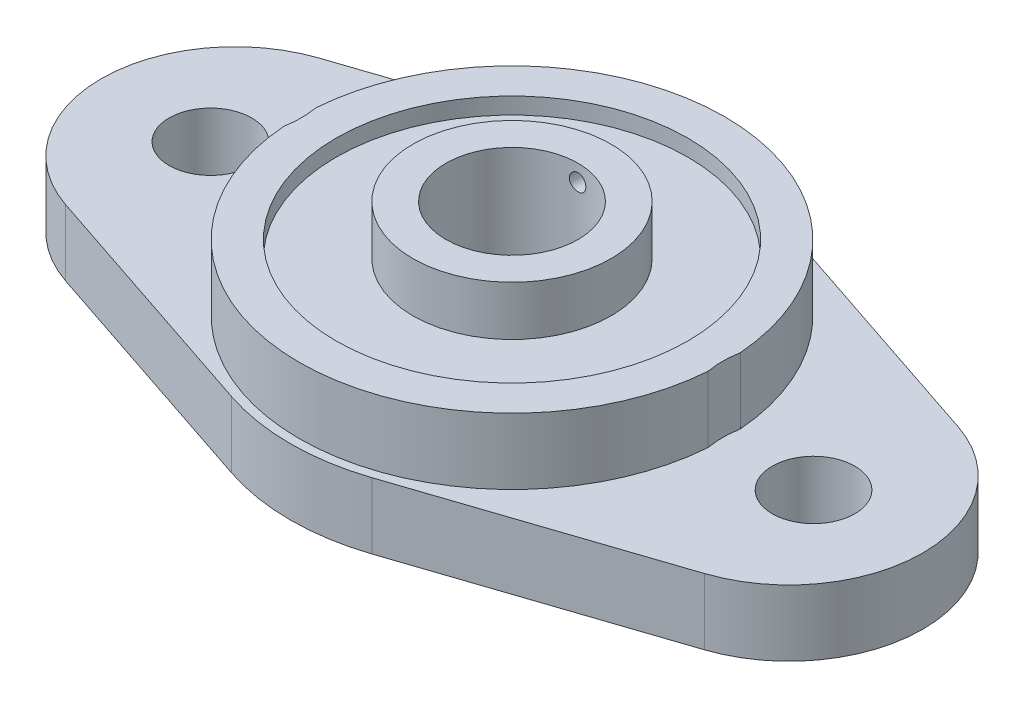
ISO-10303-21;
HEADER;
FILE_DESCRIPTION(('STEP AP214'),'2;1');
FILE_NAME('part.step','',(''),(''),'','','');
FILE_SCHEMA(('AUTOMOTIVE_DESIGN { 1 0 10303 214 1 1 1 1 }'));
ENDSEC;
DATA;
#1=APPLICATION_CONTEXT('core data for automotive mechanical design processes');
#2=APPLICATION_PROTOCOL_DEFINITION('international standard','automotive_design',2000,#1);
#3=PRODUCT_CONTEXT('',#1,'mechanical');
#4=PRODUCT('Part','Part','',(#3));
#5=PRODUCT_RELATED_PRODUCT_CATEGORY('part','',(#4));
#6=PRODUCT_DEFINITION_FORMATION('','',#4);
#7=PRODUCT_DEFINITION_CONTEXT('part definition',#1,'design');
#8=PRODUCT_DEFINITION('design','',#6,#7);
#9=PRODUCT_DEFINITION_SHAPE('','',#8);
#10=(LENGTH_UNIT() NAMED_UNIT(*) SI_UNIT(.MILLI.,.METRE.));
#11=(NAMED_UNIT(*) PLANE_ANGLE_UNIT() SI_UNIT($,.RADIAN.));
#12=(NAMED_UNIT(*) SI_UNIT($,.STERADIAN.) SOLID_ANGLE_UNIT());
#13=UNCERTAINTY_MEASURE_WITH_UNIT(LENGTH_MEASURE(1.E-05),#10,'distance_accuracy_value','');
#14=(GEOMETRIC_REPRESENTATION_CONTEXT(3) GLOBAL_UNCERTAINTY_ASSIGNED_CONTEXT((#13)) GLOBAL_UNIT_ASSIGNED_CONTEXT((#10,
#11,#12)) REPRESENTATION_CONTEXT('',''));
#15=CARTESIAN_POINT('',(0.,0.,0.));
#16=DIRECTION('',(0.,0.,1.));
#17=DIRECTION('',(1.,0.,0.));
#18=AXIS2_PLACEMENT_3D('',#15,#16,#17);
#19=CARTESIAN_POINT('',(0.,8.,0.));
#20=DIRECTION('',(0.,-1.,0.));
#21=DIRECTION('',(0.,0.,-1.));
#22=AXIS2_PLACEMENT_3D('',#19,#20,#21);
#23=CYLINDRICAL_SURFACE('',#22,12.875);
#24=CARTESIAN_POINT('',(0.,4.,0.));
#25=DIRECTION('',(0.,1.,0.));
#26=DIRECTION('',(0.,0.,1.));
#27=AXIS2_PLACEMENT_3D('',#24,#25,#26);
#28=CIRCLE('',#27,12.875);
#29=CARTESIAN_POINT('',(12.8377568493151,4.,-0.978582688312038));
#30=VERTEX_POINT('',#29);
#31=CARTESIAN_POINT('',(-12.8377568493151,4.,-0.978582688312053));
#32=VERTEX_POINT('',#31);
#33=EDGE_CURVE('E155',#30,#32,#28,.T.);
#34=ORIENTED_EDGE('',*,*,#33,.T.);
#35=DIRECTION('',(0.,1.,0.));
#36=VECTOR('',#35,1.);
#37=CARTESIAN_POINT('',(-12.8377568493151,6.,-0.978582688312049));
#38=LINE('',#37,#36);
#39=CARTESIAN_POINT('',(-12.8377568493151,8.,-0.978582688312053));
#40=VERTEX_POINT('',#39);
#41=EDGE_CURVE('E11',#32,#40,#38,.T.);
#42=ORIENTED_EDGE('',*,*,#41,.T.);
#43=CARTESIAN_POINT('',(0.,8.,0.));
#44=DIRECTION('',(0.,1.,0.));
#45=DIRECTION('',(0.,0.,1.));
#46=AXIS2_PLACEMENT_3D('',#43,#44,#45);
#47=CIRCLE('',#46,12.875);
#48=CARTESIAN_POINT('',(12.8377568493151,8.,-0.978582688312038));
#49=VERTEX_POINT('',#48);
#50=EDGE_CURVE('E188',#49,#40,#47,.T.);
#51=ORIENTED_EDGE('',*,*,#50,.F.);
#52=DIRECTION('',(0.,1.,0.));
#53=VECTOR('',#52,1.);
#54=CARTESIAN_POINT('',(12.8377568493151,6.,-0.978582688312053));
#55=LINE('',#54,#53);
#56=EDGE_CURVE('E234',#49,#30,#55,.F.);
#57=ORIENTED_EDGE('',*,*,#56,.T.);
#58=EDGE_LOOP('',(#34,#42,#51,#57));
#59=FACE_BOUND('',#58,.T.);
#60=ADVANCED_FACE('F43',(#59),#23,.T.);
#61=CARTESIAN_POINT('',(0.,10.,0.));
#62=DIRECTION('',(0.,1.,0.));
#63=DIRECTION('',(0.,0.,1.));
#64=AXIS2_PLACEMENT_3D('',#61,#62,#63);
#65=PLANE('',#64);
#66=CARTESIAN_POINT('',(0.,10.,0.));
#67=DIRECTION('',(0.,1.,0.));
#68=DIRECTION('',(0.,0.,1.));
#69=AXIS2_PLACEMENT_3D('',#66,#67,#68);
#70=CIRCLE('',#69,6.);
#71=CARTESIAN_POINT('',(0.,10.,6.));
#72=VERTEX_POINT('',#71);
#73=EDGE_CURVE('E229',#72,#72,#70,.T.);
#74=ORIENTED_EDGE('',*,*,#73,.T.);
#75=EDGE_LOOP('',(#74));
#76=FACE_BOUND('',#75,.T.);
#77=CARTESIAN_POINT('',(0.,10.,0.));
#78=DIRECTION('',(0.,1.,0.));
#79=DIRECTION('',(0.,0.,1.));
#80=AXIS2_PLACEMENT_3D('',#77,#78,#79);
#81=CIRCLE('',#80,4.);
#82=CARTESIAN_POINT('',(0.,10.,4.));
#83=VERTEX_POINT('',#82);
#84=EDGE_CURVE('E226',#83,#83,#81,.T.);
#85=ORIENTED_EDGE('',*,*,#84,.F.);
#86=EDGE_LOOP('',(#85));
#87=FACE_BOUND('',#86,.T.);
#88=ADVANCED_FACE('F338',(#76,#87),#65,.T.);
#89=CARTESIAN_POINT('',(0.,0.,0.));
#90=DIRECTION('',(0.,1.,0.));
#91=DIRECTION('',(0.,0.,1.));
#92=AXIS2_PLACEMENT_3D('',#89,#90,#91);
#93=PLANE('',#92);
#94=CARTESIAN_POINT('',(0.,0.,0.));
#95=DIRECTION('',(0.,1.,0.));
#96=DIRECTION('',(0.,0.,1.));
#97=AXIS2_PLACEMENT_3D('',#94,#95,#96);
#98=CIRCLE('',#97,4.);
#99=CARTESIAN_POINT('',(0.,0.,4.));
#100=VERTEX_POINT('',#99);
#101=EDGE_CURVE('E225',#100,#100,#98,.T.);
#102=ORIENTED_EDGE('',*,*,#101,.T.);
#103=EDGE_LOOP('',(#102));
#104=FACE_BOUND('',#103,.T.);
#105=CARTESIAN_POINT('',(-18.25,0.,0.));
#106=DIRECTION('',(0.,1.,0.));
#107=DIRECTION('',(0.,0.,1.));
#108=AXIS2_PLACEMENT_3D('',#105,#106,#107);
#109=CIRCLE('',#108,2.5);
#110=CARTESIAN_POINT('',(-18.25,0.,2.5));
#111=VERTEX_POINT('',#110);
#112=EDGE_CURVE('E251',#111,#111,#109,.T.);
#113=ORIENTED_EDGE('',*,*,#112,.T.);
#114=EDGE_LOOP('',(#113));
#115=FACE_BOUND('',#114,.T.);
#116=CARTESIAN_POINT('',(18.25,0.,0.));
#117=DIRECTION('',(0.,1.,0.));
#118=DIRECTION('',(0.,0.,1.));
#119=AXIS2_PLACEMENT_3D('',#116,#117,#118);
#120=CIRCLE('',#119,2.5);
#121=CARTESIAN_POINT('',(18.25,0.,2.49999999999999));
#122=VERTEX_POINT('',#121);
#123=EDGE_CURVE('E254',#122,#122,#120,.T.);
#124=ORIENTED_EDGE('',*,*,#123,.T.);
#125=EDGE_LOOP('',(#124));
#126=FACE_BOUND('',#125,.T.);
#127=CARTESIAN_POINT('',(0.,0.,0.));
#128=DIRECTION('',(0.,1.,0.));
#129=DIRECTION('',(0.,0.,1.));
#130=AXIS2_PLACEMENT_3D('',#127,#128,#129);
#131=CIRCLE('',#130,13.41);
#132=CARTESIAN_POINT('',(4.24863365155131,0.,-12.7191671148274));
#133=VERTEX_POINT('',#132);
#134=CARTESIAN_POINT('',(-4.24863365155131,0.,-12.7191671148274));
#135=VERTEX_POINT('',#134);
#136=EDGE_CURVE('E184',#133,#135,#131,.T.);
#137=ORIENTED_EDGE('',*,*,#136,.F.);
#138=DIRECTION('',(-0.948483752037835,0.,-0.316825775656324));
#139=VECTOR('',#138,1.);
#140=CARTESIAN_POINT('',(19.3262887828162,0.,-7.68271839150646));
#141=LINE('',#140,#139);
#142=CARTESIAN_POINT('',(19.3262887828162,0.,-7.68271839150646));
#143=VERTEX_POINT('',#142);
#144=EDGE_CURVE('E169',#143,#133,#141,.T.);
#145=ORIENTED_EDGE('',*,*,#144,.F.);
#146=CARTESIAN_POINT('',(16.76,0.,0.));
#147=DIRECTION('',(0.,1.,0.));
#148=DIRECTION('',(0.,0.,1.));
#149=AXIS2_PLACEMENT_3D('',#146,#147,#148);
#150=CIRCLE('',#149,8.1);
#151=CARTESIAN_POINT('',(19.3262887828162,0.,7.68271839150646));
#152=VERTEX_POINT('',#151);
#153=EDGE_CURVE('E198',#152,#143,#150,.T.);
#154=ORIENTED_EDGE('',*,*,#153,.F.);
#155=DIRECTION('',(0.948483752037835,0.,-0.316825775656324));
#156=VECTOR('',#155,1.);
#157=CARTESIAN_POINT('',(4.24863365155131,0.,12.7191671148274));
#158=LINE('',#157,#156);
#159=CARTESIAN_POINT('',(4.24863365155131,0.,12.7191671148274));
#160=VERTEX_POINT('',#159);
#161=EDGE_CURVE('E196',#160,#152,#158,.T.);
#162=ORIENTED_EDGE('',*,*,#161,.F.);
#163=CARTESIAN_POINT('',(0.,0.,0.));
#164=DIRECTION('',(0.,1.,0.));
#165=DIRECTION('',(0.,0.,1.));
#166=AXIS2_PLACEMENT_3D('',#163,#164,#165);
#167=CIRCLE('',#166,13.41);
#168=CARTESIAN_POINT('',(-4.24863365155132,0.,12.7191671148274));
#169=VERTEX_POINT('',#168);
#170=EDGE_CURVE('E194',#169,#160,#167,.T.);
#171=ORIENTED_EDGE('',*,*,#170,.F.);
#172=DIRECTION('',(0.948483752037835,0.,0.316825775656325));
#173=VECTOR('',#172,1.);
#174=CARTESIAN_POINT('',(-19.3262887828162,0.,7.68271839150646));
#175=LINE('',#174,#173);
#176=CARTESIAN_POINT('',(-19.3262887828162,0.,7.68271839150646));
#177=VERTEX_POINT('',#176);
#178=EDGE_CURVE('E192',#177,#169,#175,.T.);
#179=ORIENTED_EDGE('',*,*,#178,.F.);
#180=CARTESIAN_POINT('',(-16.7599999999998,0.,0.));
#181=DIRECTION('',(0.,1.,0.));
#182=DIRECTION('',(0.,0.,1.));
#183=AXIS2_PLACEMENT_3D('',#180,#181,#182);
#184=CIRCLE('',#183,8.10000000000006);
#185=CARTESIAN_POINT('',(-19.3262887828162,0.,-7.68271839150646));
#186=VERTEX_POINT('',#185);
#187=EDGE_CURVE('E190',#186,#177,#184,.T.);
#188=ORIENTED_EDGE('',*,*,#187,.F.);
#189=DIRECTION('',(-0.948483752037835,0.,0.316825775656325));
#190=VECTOR('',#189,1.);
#191=CARTESIAN_POINT('',(-4.24863365155131,0.,-12.7191671148274));
#192=LINE('',#191,#190);
#193=EDGE_CURVE('E187',#135,#186,#192,.T.);
#194=ORIENTED_EDGE('',*,*,#193,.F.);
#195=EDGE_LOOP('',(#137,#145,#154,#162,#171,#179,#188,#194));
#196=FACE_BOUND('',#195,.T.);
#197=ADVANCED_FACE('F340',(#104,#115,#126,#196),#93,.F.);
#198=CARTESIAN_POINT('',(0.,10.,0.));
#199=DIRECTION('',(0.,-1.,0.));
#200=DIRECTION('',(0.,0.,-1.));
#201=AXIS2_PLACEMENT_3D('',#198,#199,#200);
#202=CYLINDRICAL_SURFACE('',#201,6.);
#203=CARTESIAN_POINT('',(0.,9.5,-6.));
#204=CARTESIAN_POINT('',(-0.0280330449606023,9.49999877558686,-5.99999972705758));
#205=CARTESIAN_POINT('',(-0.056085173590113,9.49763451509448,-5.99980144271698));
#206=CARTESIAN_POINT('',(-0.111413285350195,9.48823782407246,-5.99902951164125));
#207=CARTESIAN_POINT('',(-0.138688352612615,9.48120010484755,-5.99845543965847));
#208=CARTESIAN_POINT('',(-0.191653011257131,9.46266142309532,-5.99699680623052));
#209=CARTESIAN_POINT('',(-0.217343490212308,9.45116298594509,-5.99611242049243));
#210=CARTESIAN_POINT('',(-0.266423616708038,9.424033784064,-5.99413233872356));
#211=CARTESIAN_POINT('',(-0.289813754942695,9.40840390326125,-5.99303668790679));
#212=CARTESIAN_POINT('',(-0.333694999982796,9.373412466697,-5.99075389933356));
#213=CARTESIAN_POINT('',(-0.354179436208081,9.35404255803216,-5.98956656043288));
#214=CARTESIAN_POINT('',(-0.391610566768278,9.31213855207503,-5.98723590401584));
#215=CARTESIAN_POINT('',(-0.408557105685754,9.28960431584869,-5.9860925884352));
#216=CARTESIAN_POINT('',(-0.438453961195115,9.24197094145049,-5.98397726330621));
#217=CARTESIAN_POINT('',(-0.451398416475772,9.21686811229861,-5.98300550590046));
#218=CARTESIAN_POINT('',(-0.472886216886923,9.16483585222201,-5.98134562224137));
#219=CARTESIAN_POINT('',(-0.481429639756209,9.13790645357087,-5.98065749097816));
#220=CARTESIAN_POINT('',(-0.493853514909286,9.08305230405941,-5.97964446033161));
#221=CARTESIAN_POINT('',(-0.497744832694888,9.0551300300037,-5.9793187146811));
#222=CARTESIAN_POINT('',(-0.500787604007714,8.99902689802732,-5.97906466160738));
#223=CARTESIAN_POINT('',(-0.49993914648977,8.9708460449695,-5.9791363467253));
#224=CARTESIAN_POINT('',(-0.493535432107424,8.91510016724474,-5.97966828680819));
#225=CARTESIAN_POINT('',(-0.487991984019029,8.8875337754618,-5.98012756688926));
#226=CARTESIAN_POINT('',(-0.472373992691471,8.83372406630353,-5.98138141784683));
#227=CARTESIAN_POINT('',(-0.462299405198393,8.80748076185308,-5.982175991998));
#228=CARTESIAN_POINT('',(-0.437891894076017,8.75702454706095,-5.98401202353426));
#229=CARTESIAN_POINT('',(-0.423553672378598,8.73281421120625,-5.98505378775482));
#230=CARTESIAN_POINT('',(-0.391029721956675,8.6871393305901,-5.9872665343194));
#231=CARTESIAN_POINT('',(-0.372843915311271,8.66567484145139,-5.98843751928016));
#232=CARTESIAN_POINT('',(-0.333074791113182,8.62603229035922,-5.99078110205823));
#233=CARTESIAN_POINT('',(-0.311481264695288,8.60786446793538,-5.99195369387533));
#234=CARTESIAN_POINT('',(-0.265545278185876,8.57541013830572,-5.99416495934917));
#235=CARTESIAN_POINT('',(-0.241202816257669,8.56112363369322,-5.99520363291643));
#236=CARTESIAN_POINT('',(-0.190453296633925,8.53683811866565,-5.9970302290482));
#237=CARTESIAN_POINT('',(-0.164046020904537,8.52683956176092,-5.99781812508722));
#238=CARTESIAN_POINT('',(-0.109919534509791,8.51142093377434,-5.99905408705899));
#239=CARTESIAN_POINT('',(-0.0822003510844272,8.50600076767237,-5.99950216004443));
#240=CARTESIAN_POINT('',(-0.0263256500821249,8.49990561797921,-6.00000708471525));
#241=CARTESIAN_POINT('',(0.0018283145575986,8.49921649094655,-6.00006510246001));
#242=CARTESIAN_POINT('',(0.0578513762516522,8.50256593031366,-5.9997864938935));
#243=CARTESIAN_POINT('',(0.085720475960707,8.50660445261473,-5.99944987126337));
#244=CARTESIAN_POINT('',(0.14034237811235,8.51928282930505,-5.9984205892066));
#245=CARTESIAN_POINT('',(0.167096712569862,8.52791612801291,-5.9977284370871));
#246=CARTESIAN_POINT('',(0.218777082541245,8.54953229389102,-5.99606585056176));
#247=CARTESIAN_POINT('',(0.243703089141567,8.56251522982925,-5.99509541175621));
#248=CARTESIAN_POINT('',(0.291083609150954,8.59249767460818,-5.99298213196816));
#249=CARTESIAN_POINT('',(0.313532175260735,8.60950655319741,-5.99183889109368));
#250=CARTESIAN_POINT('',(0.355260547421811,8.64704452852524,-5.98950979319849));
#251=CARTESIAN_POINT('',(0.374540298407192,8.66757368642464,-5.98832393543763));
#252=CARTESIAN_POINT('',(0.409432272727551,8.71163084609917,-5.98603980607911));
#253=CARTESIAN_POINT('',(0.425035266616819,8.7351661705987,-5.98494175937111));
#254=CARTESIAN_POINT('',(0.452067531419759,8.78453113143171,-5.9829607587216));
#255=CARTESIAN_POINT('',(0.463496844004982,8.81036074485497,-5.98207780263258));
#256=CARTESIAN_POINT('',(0.481841588720282,8.86354839526962,-5.9806282142447));
#257=CARTESIAN_POINT('',(0.488762670724645,8.89090447235717,-5.98006118614317));
#258=CARTESIAN_POINT('',(0.497912884955077,8.94639534993721,-5.97930632845426));
#259=CARTESIAN_POINT('',(0.500142107284133,8.9745301354648,-5.97911849158484));
#260=CARTESIAN_POINT('',(0.499844281445465,9.03068806301045,-5.97914338975097));
#261=CARTESIAN_POINT('',(0.497331734888695,9.05871128361822,-5.97935490346535));
#262=CARTESIAN_POINT('',(0.487651931647515,9.11393626677543,-5.98015207541153));
#263=CARTESIAN_POINT('',(0.480484667863814,9.14113802807192,-5.98073773421398));
#264=CARTESIAN_POINT('',(0.461702555008531,9.19394888163331,-5.98221688565853));
#265=CARTESIAN_POINT('',(0.450087967003266,9.21955806728285,-5.98311036023095));
#266=CARTESIAN_POINT('',(0.422742529473625,9.26846542028684,-5.98510449937535));
#267=CARTESIAN_POINT('',(0.407011744557279,9.29176362390666,-5.98620516069524));
#268=CARTESIAN_POINT('',(0.371825971061224,9.33546186950651,-5.98849365849341));
#269=CARTESIAN_POINT('',(0.35236024687073,9.35585325432867,-5.98968174002872));
#270=CARTESIAN_POINT('',(0.310276612796233,9.39308759260166,-5.99200897504839));
#271=CARTESIAN_POINT('',(0.287657941320546,9.40992968624801,-5.99314811662412));
#272=CARTESIAN_POINT('',(0.239866886514707,9.43960993020878,-5.99525117421137));
#273=CARTESIAN_POINT('',(0.214689828135269,9.45244056932816,-5.99621476011552));
#274=CARTESIAN_POINT('',(0.162547875997866,9.47367590152564,-5.9978542625815));
#275=CARTESIAN_POINT('',(0.135585077706825,9.48208568214405,-5.99853050964128));
#276=CARTESIAN_POINT('',(0.0903860240483398,9.49209879125103,-5.99934553866926));
#277=CARTESIAN_POINT('',(0.0724404472192353,9.49505780625874,-5.99958984438477));
#278=CARTESIAN_POINT('',(0.0363325857505812,9.4990088048386,-5.99991716329316));
#279=CARTESIAN_POINT('',(0.0181703016865225,9.50000079363324,-6.00000017691429));
#280=CARTESIAN_POINT('',(0.,9.5,-6.));
#281=B_SPLINE_CURVE_WITH_KNOTS('',3,(#203,#204,#205,#206,#207,#208,#209,#210,#211,#212,#213,
#214,#215,#216,#217,#218,#219,#220,#221,#222,#223,#224,#225,#226,#227,#228,#229,#230,#231,#232,
#233,#234,#235,#236,#237,#238,#239,#240,#241,#242,#243,#244,#245,#246,#247,#248,#249,#250,#251,
#252,#253,#254,#255,#256,#257,#258,#259,#260,#261,#262,#263,#264,#265,#266,#267,#268,#269,#270,
#271,#272,#273,#274,#275,#276,#277,#278,#279,#280),.UNSPECIFIED.,.T.,.F.,(4,2,2,2,2,2,2,2,2,2,2,
2,2,2,2,2,2,2,2,2,2,2,2,2,2,2,2,2,2,2,2,2,2,2,2,2,2,2,4),(0.,0.08403279340007,0.168160844498918,
0.252241336944478,0.336303854792091,0.420556334392882,0.50481251436966,0.589191514755458,
0.673569024639505,0.757749074157934,0.841927543813095,0.925894915551446,1.00986310738499,
1.0939360787445,1.1780107529043,1.26234225467575,1.34667381279322,1.43101428795225,
1.51535301266268,1.59943949653584,1.68352519607111,1.76749124515393,1.85145862180686,
1.93562337487463,2.01978959035625,2.10416488245601,2.18853933209914,2.27280783620464,
2.35707472199379,2.44108431441264,2.5250940349617,2.60909882473762,2.69310229604928,
2.77735094332319,2.8616199761624,2.94604586531277,3.03037438295893,3.08484243178331,
3.13931033599373),.UNSPECIFIED.);
#282=CARTESIAN_POINT('',(0.,9.5,-6.));
#283=VERTEX_POINT('',#282);
#284=EDGE_CURVE('E262',#283,#283,#281,.T.);
#285=ORIENTED_EDGE('',*,*,#284,.T.);
#286=EDGE_LOOP('',(#285));
#287=FACE_BOUND('',#286,.T.);
#288=CARTESIAN_POINT('',(0.,7.,0.));
#289=DIRECTION('',(0.,1.,0.));
#290=DIRECTION('',(0.,0.,1.));
#291=AXIS2_PLACEMENT_3D('',#288,#289,#290);
#292=CIRCLE('',#291,6.);
#293=CARTESIAN_POINT('',(0.,7.,6.));
#294=VERTEX_POINT('',#293);
#295=EDGE_CURVE('E222',#294,#294,#292,.T.);
#296=ORIENTED_EDGE('',*,*,#295,.T.);
#297=EDGE_LOOP('',(#296));
#298=FACE_BOUND('',#297,.T.);
#299=ORIENTED_EDGE('',*,*,#73,.F.);
#300=EDGE_LOOP('',(#299));
#301=FACE_BOUND('',#300,.T.);
#302=ADVANCED_FACE('F45',(#287,#298,#301),#202,.T.);
#303=CARTESIAN_POINT('',(0.,10.,0.));
#304=DIRECTION('',(0.,-1.,0.));
#305=DIRECTION('',(0.,0.,-1.));
#306=AXIS2_PLACEMENT_3D('',#303,#304,#305);
#307=CYLINDRICAL_SURFACE('',#306,4.);
#308=CARTESIAN_POINT('',(0.,9.5,-4.));
#309=CARTESIAN_POINT('',(-0.0279682191111522,9.49999881181286,-3.99999960979286));
#310=CARTESIAN_POINT('',(-0.0559539148605493,9.49764542416614,-3.9997035691098));
#311=CARTESIAN_POINT('',(-0.111146560417951,9.48829444908584,-3.99855108022272));
#312=CARTESIAN_POINT('',(-0.138352666124749,9.48129201241532,-3.99769404688286));
#313=CARTESIAN_POINT('',(-0.191179114962611,9.46285247121718,-3.99551612208881));
#314=CARTESIAN_POINT('',(-0.216800512029228,9.45141835163803,-3.99419554291108));
#315=CARTESIAN_POINT('',(-0.265755894978607,9.42444654320604,-3.9912374017562));
#316=CARTESIAN_POINT('',(-0.289090272311274,9.40890955829386,-3.98959989416823));
#317=CARTESIAN_POINT('',(-0.332942563386264,9.37408161003208,-3.98618064261265));
#318=CARTESIAN_POINT('',(-0.353446072987425,9.35477257413075,-3.98439822938483));
#319=CARTESIAN_POINT('',(-0.390930558711499,9.31298743529267,-3.9808954520195));
#320=CARTESIAN_POINT('',(-0.407911355278451,9.29051117101735,-3.97917509104854));
#321=CARTESIAN_POINT('',(-0.437922032256788,9.24293600448687,-3.97598461123917));
#322=CARTESIAN_POINT('',(-0.450938419188215,9.21782852768641,-3.97451535435582));
#323=CARTESIAN_POINT('',(-0.472564615315023,9.16576258961053,-3.97200225691537));
#324=CARTESIAN_POINT('',(-0.481174591613043,9.1388041985706,-3.97095840022627));
#325=CARTESIAN_POINT('',(-0.493699796004953,9.08395116088265,-3.96942067920723));
#326=CARTESIAN_POINT('',(-0.49763934294634,9.05606214845916,-3.96892396687349));
#327=CARTESIAN_POINT('',(-0.500787109911446,9.00001474730564,-3.96852805628558));
#328=CARTESIAN_POINT('',(-0.499995520200484,8.97185636945374,-3.96862883400302));
#329=CARTESIAN_POINT('',(-0.493723447289581,8.91623903455024,-3.9694139107395));
#330=CARTESIAN_POINT('',(-0.488269752596939,8.88877700275995,-3.97009487592066));
#331=CARTESIAN_POINT('',(-0.47287007663641,8.8351609957562,-3.97195839951526));
#332=CARTESIAN_POINT('',(-0.46292400435038,8.80900704705719,-3.97314096809145));
#333=CARTESIAN_POINT('',(-0.438793111982329,8.75866640019566,-3.9758782317293));
#334=CARTESIAN_POINT('',(-0.424596650741527,8.7344853399502,-3.97743394642289));
#335=CARTESIAN_POINT('',(-0.392376293891383,8.68883866111735,-3.9807414228612));
#336=CARTESIAN_POINT('',(-0.374352223216155,8.66737316680526,-3.98249319357133));
#337=CARTESIAN_POINT('',(-0.334839822150756,8.62761145785545,-3.98601021978085));
#338=CARTESIAN_POINT('',(-0.313328401568002,8.60933818164681,-3.98777548477378));
#339=CARTESIAN_POINT('',(-0.267531433822785,8.57665822399389,-3.9911092651117));
#340=CARTESIAN_POINT('',(-0.243245880263651,8.5622515514656,-3.99267778000301));
#341=CARTESIAN_POINT('',(-0.192572334272697,8.53771373590722,-3.99544230443716));
#342=CARTESIAN_POINT('',(-0.166183639067544,8.52758402922376,-3.99663818880307));
#343=CARTESIAN_POINT('',(-0.112061588086211,8.51190590129535,-3.99852157156012));
#344=CARTESIAN_POINT('',(-0.0843282953261333,8.50635726557259,-3.99920909375174));
#345=CARTESIAN_POINT('',(-0.0285026327826991,8.50002851514789,-3.99999519282152));
#346=CARTESIAN_POINT('',(-0.000413898039721187,8.49921680152719,-4.00009767228527));
#347=CARTESIAN_POINT('',(0.0554992072994993,8.50230154681119,-3.99971267601086));
#348=CARTESIAN_POINT('',(0.0833235835129413,8.50619790545032,-3.99922521283642));
#349=CARTESIAN_POINT('',(0.137824901544304,8.51856194175488,-3.99771753751338));
#350=CARTESIAN_POINT('',(0.164505314084941,8.52701455268053,-3.99669908162774));
#351=CARTESIAN_POINT('',(0.216069930971682,8.54823549038258,-3.99424344620039));
#352=CARTESIAN_POINT('',(0.240954074293063,8.56100396369829,-3.99280625244125));
#353=CARTESIAN_POINT('',(0.288360904137486,8.59057062750149,-3.98966364582022));
#354=CARTESIAN_POINT('',(0.310870751988764,8.60738925796113,-3.98795688808502));
#355=CARTESIAN_POINT('',(0.352759397925264,8.64454989950684,-3.98447028465131));
#356=CARTESIAN_POINT('',(0.372138071667372,8.6648920504502,-3.9826904360538));
#357=CARTESIAN_POINT('',(0.407326391763603,8.70866148335143,-3.97924621092517));
#358=CARTESIAN_POINT('',(0.423115092113586,8.73210566926208,-3.97758254944265));
#359=CARTESIAN_POINT('',(0.450530577888701,8.78133164897094,-3.9745708220743));
#360=CARTESIAN_POINT('',(0.462157446745673,8.80711339589531,-3.97322274986205));
#361=CARTESIAN_POINT('',(0.480885315773308,8.86021506382952,-3.97099970078599));
#362=CARTESIAN_POINT('',(0.487998125491422,8.8875307660096,-3.97012349036958));
#363=CARTESIAN_POINT('',(0.497533998773569,8.94298049675613,-3.96893983181491));
#364=CARTESIAN_POINT('',(0.499957280507153,8.9711144871918,-3.96863235721755));
#365=CARTESIAN_POINT('',(0.500041307216967,9.02719378584094,-3.96862175396491));
#366=CARTESIAN_POINT('',(0.497734959539855,9.05513904966638,-3.96891444950391));
#367=CARTESIAN_POINT('',(0.488494880969866,9.11024142586902,-3.9700622290744));
#368=CARTESIAN_POINT('',(0.481561149581154,9.13739853816176,-3.97091731316616));
#369=CARTESIAN_POINT('',(0.463273414737932,9.19014939135328,-3.9730922315491));
#370=CARTESIAN_POINT('',(0.451920996194187,9.21574368900436,-3.97441189918557));
#371=CARTESIAN_POINT('',(0.425121380430062,9.26466933080966,-3.97736756648964));
#372=CARTESIAN_POINT('',(0.409674131901919,9.28800064660397,-3.97900357012082));
#373=CARTESIAN_POINT('',(0.375001266253168,9.3319062450681,-3.98242120950447));
#374=CARTESIAN_POINT('',(0.355751125154992,9.352461092191,-3.98420374416807));
#375=CARTESIAN_POINT('',(0.314070045393677,9.3900613650336,-3.9877056631858));
#376=CARTESIAN_POINT('',(0.291638357828314,9.40710596215486,-3.98942503255118));
#377=CARTESIAN_POINT('',(0.244133124170843,9.43725707142106,-3.99261411317349));
#378=CARTESIAN_POINT('',(0.219049855919234,9.45034836117985,-3.9940828501566));
#379=CARTESIAN_POINT('',(0.167036580460255,9.47211424858326,-3.99659529815345));
#380=CARTESIAN_POINT('',(0.140108616174047,9.48079364527069,-3.99763947073915));
#381=CARTESIAN_POINT('',(0.0942011543935844,9.49141186763426,-3.99893344065549));
#382=CARTESIAN_POINT('',(0.0755111327033838,9.49462778839641,-3.99933145179091));
#383=CARTESIAN_POINT('',(0.0378834126424868,9.49892224913865,-3.99986486265838));
#384=CARTESIAN_POINT('',(0.0189457160992054,9.50000080487986,-4.00000026432694));
#385=CARTESIAN_POINT('',(0.,9.5,-4.));
#386=B_SPLINE_CURVE_WITH_KNOTS('',3,(#308,#309,#310,#311,#312,#313,#314,#315,#316,#317,#318,
#319,#320,#321,#322,#323,#324,#325,#326,#327,#328,#329,#330,#331,#332,#333,#334,#335,#336,#337,
#338,#339,#340,#341,#342,#343,#344,#345,#346,#347,#348,#349,#350,#351,#352,#353,#354,#355,#356,
#357,#358,#359,#360,#361,#362,#363,#364,#365,#366,#367,#368,#369,#370,#371,#372,#373,#374,#375,
#376,#377,#378,#379,#380,#381,#382,#383,#384,#385),.UNSPECIFIED.,.T.,.F.,(4,2,2,2,2,2,2,2,2,2,2,
2,2,2,2,2,2,2,2,2,2,2,2,2,2,2,2,2,2,2,2,2,2,2,2,2,2,2,4),(0.,0.0838354545552494,
0.167758492188685,0.251625101636355,0.335477331182147,0.419741626403686,0.504010215600022,
0.588562500637739,0.673111578993614,0.757218450572639,0.841321939769328,0.924945392883386,
1.00857054033249,1.09242685257107,1.17628700102728,1.26072695627283,1.34516710622623,
1.42963559146321,1.51410012180756,1.59800055878384,1.68189920900386,1.76552210778679,
1.8491478461579,1.93320480585685,2.01726510275018,2.10180394301515,2.18634108844308,
2.27065614856185,2.35496728602125,2.43869380240443,2.5224203277591,2.60611684941298,
2.68981441982453,2.77407047538366,2.85834639694003,2.94294280607371,3.02744699736807,
3.08423768637526,3.14102795660088),.UNSPECIFIED.);
#387=CARTESIAN_POINT('',(0.,9.5,-4.));
#388=VERTEX_POINT('',#387);
#389=EDGE_CURVE('E48',#388,#388,#386,.T.);
#390=ORIENTED_EDGE('',*,*,#389,.F.);
#391=EDGE_LOOP('',(#390));
#392=FACE_BOUND('',#391,.T.);
#393=ORIENTED_EDGE('',*,*,#84,.T.);
#394=EDGE_LOOP('',(#393));
#395=FACE_BOUND('',#394,.T.);
#396=ORIENTED_EDGE('',*,*,#101,.F.);
#397=EDGE_LOOP('',(#396));
#398=FACE_BOUND('',#397,.T.);
#399=ADVANCED_FACE('F332',(#392,#395,#398),#307,.F.);
#400=CARTESIAN_POINT('',(0.,7.,0.));
#401=DIRECTION('',(0.,1.,0.));
#402=DIRECTION('',(0.,0.,1.));
#403=AXIS2_PLACEMENT_3D('',#400,#401,#402);
#404=PLANE('',#403);
#405=CARTESIAN_POINT('',(0.,7.,0.));
#406=DIRECTION('',(0.,1.,0.));
#407=DIRECTION('',(0.,0.,1.));
#408=AXIS2_PLACEMENT_3D('',#405,#406,#407);
#409=CIRCLE('',#408,10.64);
#410=CARTESIAN_POINT('',(0.,7.,10.64));
#411=VERTEX_POINT('',#410);
#412=EDGE_CURVE('E158',#411,#411,#409,.F.);
#413=ORIENTED_EDGE('',*,*,#412,.F.);
#414=EDGE_LOOP('',(#413));
#415=FACE_BOUND('',#414,.T.);
#416=ORIENTED_EDGE('',*,*,#295,.F.);
#417=EDGE_LOOP('',(#416));
#418=FACE_BOUND('',#417,.T.);
#419=ADVANCED_FACE('F300',(#415,#418),#404,.T.);
#420=CARTESIAN_POINT('',(0.,4.,0.));
#421=DIRECTION('',(0.,1.,0.));
#422=DIRECTION('',(0.,0.,1.));
#423=AXIS2_PLACEMENT_3D('',#420,#421,#422);
#424=PLANE('',#423);
#425=CARTESIAN_POINT('',(-12.8377568493151,4.,0.978582688312053));
#426=VERTEX_POINT('',#425);
#427=CARTESIAN_POINT('',(12.8377568493151,4.,0.978582688312029));
#428=VERTEX_POINT('',#427);
#429=EDGE_CURVE('E148',#426,#428,#28,.T.);
#430=ORIENTED_EDGE('',*,*,#429,.F.);
#431=CARTESIAN_POINT('',(-18.25,4.,0.));
#432=DIRECTION('',(0.,1.,0.));
#433=DIRECTION('',(0.,0.,1.));
#434=AXIS2_PLACEMENT_3D('',#431,#432,#433);
#435=CIRCLE('',#434,5.5);
#436=EDGE_CURVE('E65',#32,#426,#435,.F.);
#437=ORIENTED_EDGE('',*,*,#436,.F.);
#438=ORIENTED_EDGE('',*,*,#33,.F.);
#439=CARTESIAN_POINT('',(18.25,4.,0.));
#440=DIRECTION('',(0.,1.,0.));
#441=DIRECTION('',(0.,0.,1.));
#442=AXIS2_PLACEMENT_3D('',#439,#440,#441);
#443=CIRCLE('',#442,5.5);
#444=EDGE_CURVE('E70',#428,#30,#443,.F.);
#445=ORIENTED_EDGE('',*,*,#444,.F.);
#446=EDGE_LOOP('',(#430,#437,#438,#445));
#447=FACE_BOUND('',#446,.T.);
#448=CARTESIAN_POINT('',(0.,4.,0.));
#449=DIRECTION('',(0.,1.,0.));
#450=DIRECTION('',(0.,0.,1.));
#451=AXIS2_PLACEMENT_3D('',#448,#449,#450);
#452=CIRCLE('',#451,13.41);
#453=CARTESIAN_POINT('',(4.24863365155131,4.,-12.7191671148274));
#454=VERTEX_POINT('',#453);
#455=CARTESIAN_POINT('',(-4.24863365155131,4.,-12.7191671148274));
#456=VERTEX_POINT('',#455);
#457=EDGE_CURVE('E165',#454,#456,#452,.T.);
#458=ORIENTED_EDGE('',*,*,#457,.T.);
#459=DIRECTION('',(-0.948483752037835,0.,0.316825775656325));
#460=VECTOR('',#459,1.);
#461=CARTESIAN_POINT('',(-4.24863365155131,4.,-12.7191671148274));
#462=LINE('',#461,#460);
#463=CARTESIAN_POINT('',(-19.3262887828162,4.,-7.68271839150646));
#464=VERTEX_POINT('',#463);
#465=EDGE_CURVE('E168',#456,#464,#462,.T.);
#466=ORIENTED_EDGE('',*,*,#465,.T.);
#467=CARTESIAN_POINT('',(-16.7599999999998,4.,0.));
#468=DIRECTION('',(0.,1.,0.));
#469=DIRECTION('',(0.,0.,1.));
#470=AXIS2_PLACEMENT_3D('',#467,#468,#469);
#471=CIRCLE('',#470,8.10000000000006);
#472=CARTESIAN_POINT('',(-19.3262887828162,4.,7.68271839150646));
#473=VERTEX_POINT('',#472);
#474=EDGE_CURVE('E171',#464,#473,#471,.T.);
#475=ORIENTED_EDGE('',*,*,#474,.T.);
#476=DIRECTION('',(0.948483752037835,0.,0.316825775656325));
#477=VECTOR('',#476,1.);
#478=CARTESIAN_POINT('',(-19.3262887828162,4.,7.68271839150646));
#479=LINE('',#478,#477);
#480=CARTESIAN_POINT('',(-4.24863365155132,4.,12.7191671148274));
#481=VERTEX_POINT('',#480);
#482=EDGE_CURVE('E173',#473,#481,#479,.T.);
#483=ORIENTED_EDGE('',*,*,#482,.T.);
#484=CARTESIAN_POINT('',(0.,4.,0.));
#485=DIRECTION('',(0.,1.,0.));
#486=DIRECTION('',(0.,0.,1.));
#487=AXIS2_PLACEMENT_3D('',#484,#485,#486);
#488=CIRCLE('',#487,13.41);
#489=CARTESIAN_POINT('',(4.24863365155131,4.,12.7191671148274));
#490=VERTEX_POINT('',#489);
#491=EDGE_CURVE('E175',#481,#490,#488,.T.);
#492=ORIENTED_EDGE('',*,*,#491,.T.);
#493=DIRECTION('',(0.948483752037835,0.,-0.316825775656324));
#494=VECTOR('',#493,1.);
#495=CARTESIAN_POINT('',(4.24863365155131,4.,12.7191671148274));
#496=LINE('',#495,#494);
#497=CARTESIAN_POINT('',(19.3262887828162,4.,7.68271839150646));
#498=VERTEX_POINT('',#497);
#499=EDGE_CURVE('E177',#490,#498,#496,.T.);
#500=ORIENTED_EDGE('',*,*,#499,.T.);
#501=CARTESIAN_POINT('',(16.76,4.,0.));
#502=DIRECTION('',(0.,1.,0.));
#503=DIRECTION('',(0.,0.,1.));
#504=AXIS2_PLACEMENT_3D('',#501,#502,#503);
#505=CIRCLE('',#504,8.1);
#506=CARTESIAN_POINT('',(19.3262887828162,4.,-7.68271839150646));
#507=VERTEX_POINT('',#506);
#508=EDGE_CURVE('E179',#498,#507,#505,.T.);
#509=ORIENTED_EDGE('',*,*,#508,.T.);
#510=DIRECTION('',(-0.948483752037835,0.,-0.316825775656324));
#511=VECTOR('',#510,1.);
#512=CARTESIAN_POINT('',(19.3262887828162,4.,-7.68271839150646));
#513=LINE('',#512,#511);
#514=EDGE_CURVE('E181',#507,#454,#513,.T.);
#515=ORIENTED_EDGE('',*,*,#514,.T.);
#516=EDGE_LOOP('',(#458,#466,#475,#483,#492,#500,#509,#515));
#517=FACE_BOUND('',#516,.T.);
#518=CARTESIAN_POINT('',(18.25,4.,0.));
#519=DIRECTION('',(0.,1.,0.));
#520=DIRECTION('',(0.,0.,1.));
#521=AXIS2_PLACEMENT_3D('',#518,#519,#520);
#522=CIRCLE('',#521,2.5);
#523=CARTESIAN_POINT('',(18.25,4.,2.49999999999999));
#524=VERTEX_POINT('',#523);
#525=EDGE_CURVE('E140',#524,#524,#522,.T.);
#526=ORIENTED_EDGE('',*,*,#525,.F.);
#527=EDGE_LOOP('',(#526));
#528=FACE_BOUND('',#527,.T.);
#529=CARTESIAN_POINT('',(-18.25,4.,0.));
#530=DIRECTION('',(0.,1.,0.));
#531=DIRECTION('',(0.,0.,1.));
#532=AXIS2_PLACEMENT_3D('',#529,#530,#531);
#533=CIRCLE('',#532,2.5);
#534=CARTESIAN_POINT('',(-18.25,4.,2.5));
#535=VERTEX_POINT('',#534);
#536=EDGE_CURVE('E247',#535,#535,#533,.T.);
#537=ORIENTED_EDGE('',*,*,#536,.F.);
#538=EDGE_LOOP('',(#537));
#539=FACE_BOUND('',#538,.T.);
#540=ADVANCED_FACE('F153',(#447,#517,#528,#539),#424,.T.);
#541=CARTESIAN_POINT('',(0.,4.,0.));
#542=DIRECTION('',(0.,-1.,0.));
#543=DIRECTION('',(0.,0.,-1.));
#544=AXIS2_PLACEMENT_3D('',#541,#542,#543);
#545=CYLINDRICAL_SURFACE('',#544,13.41);
#546=ORIENTED_EDGE('',*,*,#136,.T.);
#547=DIRECTION('',(0.,-1.,0.));
#548=VECTOR('',#547,1.);
#549=CARTESIAN_POINT('',(-4.24863365155131,4.,-12.7191671148274));
#550=LINE('',#549,#548);
#551=EDGE_CURVE('E156',#456,#135,#550,.T.);
#552=ORIENTED_EDGE('',*,*,#551,.F.);
#553=ORIENTED_EDGE('',*,*,#457,.F.);
#554=DIRECTION('',(0.,-1.,0.));
#555=VECTOR('',#554,1.);
#556=CARTESIAN_POINT('',(4.24863365155131,4.,-12.7191671148274));
#557=LINE('',#556,#555);
#558=EDGE_CURVE('E183',#454,#133,#557,.T.);
#559=ORIENTED_EDGE('',*,*,#558,.T.);
#560=EDGE_LOOP('',(#546,#552,#553,#559));
#561=FACE_BOUND('',#560,.T.);
#562=ADVANCED_FACE('F299',(#561),#545,.T.);
#563=CARTESIAN_POINT('',(-4.24863365155131,4.,-12.7191671148274));
#564=DIRECTION('',(0.316825775656325,0.,0.948483752037835));
#565=DIRECTION('',(0.948483752037835,0.,-0.316825775656325));
#566=AXIS2_PLACEMENT_3D('',#563,#564,#565);
#567=PLANE('',#566);
#568=ORIENTED_EDGE('',*,*,#193,.T.);
#569=DIRECTION('',(0.,-1.,0.));
#570=VECTOR('',#569,1.);
#571=CARTESIAN_POINT('',(-19.3262887828162,4.,-7.68271839150646));
#572=LINE('',#571,#570);
#573=EDGE_CURVE('E160',#464,#186,#572,.T.);
#574=ORIENTED_EDGE('',*,*,#573,.F.);
#575=ORIENTED_EDGE('',*,*,#465,.F.);
#576=ORIENTED_EDGE('',*,*,#551,.T.);
#577=EDGE_LOOP('',(#568,#574,#575,#576));
#578=FACE_BOUND('',#577,.T.);
#579=ADVANCED_FACE('F323',(#578),#567,.F.);
#580=CARTESIAN_POINT('',(-16.7599999999998,4.,0.));
#581=DIRECTION('',(0.,-1.,0.));
#582=DIRECTION('',(0.,0.,-1.));
#583=AXIS2_PLACEMENT_3D('',#580,#581,#582);
#584=CYLINDRICAL_SURFACE('',#583,8.10000000000006);
#585=ORIENTED_EDGE('',*,*,#187,.T.);
#586=DIRECTION('',(0.,-1.,0.));
#587=VECTOR('',#586,1.);
#588=CARTESIAN_POINT('',(-19.3262887828162,4.,7.68271839150646));
#589=LINE('',#588,#587);
#590=EDGE_CURVE('E215',#473,#177,#589,.T.);
#591=ORIENTED_EDGE('',*,*,#590,.F.);
#592=ORIENTED_EDGE('',*,*,#474,.F.);
#593=ORIENTED_EDGE('',*,*,#573,.T.);
#594=EDGE_LOOP('',(#585,#591,#592,#593));
#595=FACE_BOUND('',#594,.T.);
#596=ADVANCED_FACE('F319',(#595),#584,.T.);
#597=CARTESIAN_POINT('',(-19.3262887828162,4.,7.68271839150646));
#598=DIRECTION('',(0.316825775656325,0.,-0.948483752037835));
#599=DIRECTION('',(-0.948483752037835,0.,-0.316825775656325));
#600=AXIS2_PLACEMENT_3D('',#597,#598,#599);
#601=PLANE('',#600);
#602=ORIENTED_EDGE('',*,*,#178,.T.);
#603=DIRECTION('',(0.,-1.,0.));
#604=VECTOR('',#603,1.);
#605=CARTESIAN_POINT('',(-4.24863365155132,4.,12.7191671148274));
#606=LINE('',#605,#604);
#607=EDGE_CURVE('E212',#481,#169,#606,.T.);
#608=ORIENTED_EDGE('',*,*,#607,.F.);
#609=ORIENTED_EDGE('',*,*,#482,.F.);
#610=ORIENTED_EDGE('',*,*,#590,.T.);
#611=EDGE_LOOP('',(#602,#608,#609,#610));
#612=FACE_BOUND('',#611,.T.);
#613=ADVANCED_FACE('F315',(#612),#601,.F.);
#614=CARTESIAN_POINT('',(0.,4.,0.));
#615=DIRECTION('',(0.,-1.,0.));
#616=DIRECTION('',(0.,0.,-1.));
#617=AXIS2_PLACEMENT_3D('',#614,#615,#616);
#618=CYLINDRICAL_SURFACE('',#617,13.41);
#619=ORIENTED_EDGE('',*,*,#170,.T.);
#620=DIRECTION('',(0.,-1.,0.));
#621=VECTOR('',#620,1.);
#622=CARTESIAN_POINT('',(4.24863365155131,4.,12.7191671148274));
#623=LINE('',#622,#621);
#624=EDGE_CURVE('E209',#490,#160,#623,.T.);
#625=ORIENTED_EDGE('',*,*,#624,.F.);
#626=ORIENTED_EDGE('',*,*,#491,.F.);
#627=ORIENTED_EDGE('',*,*,#607,.T.);
#628=EDGE_LOOP('',(#619,#625,#626,#627));
#629=FACE_BOUND('',#628,.T.);
#630=ADVANCED_FACE('F311',(#629),#618,.T.);
#631=CARTESIAN_POINT('',(4.24863365155131,4.,12.7191671148274));
#632=DIRECTION('',(-0.316825775656324,0.,-0.948483752037835));
#633=DIRECTION('',(-0.948483752037835,0.,0.316825775656324));
#634=AXIS2_PLACEMENT_3D('',#631,#632,#633);
#635=PLANE('',#634);
#636=ORIENTED_EDGE('',*,*,#161,.T.);
#637=DIRECTION('',(0.,-1.,0.));
#638=VECTOR('',#637,1.);
#639=CARTESIAN_POINT('',(19.3262887828162,4.,7.68271839150646));
#640=LINE('',#639,#638);
#641=EDGE_CURVE('E206',#498,#152,#640,.T.);
#642=ORIENTED_EDGE('',*,*,#641,.F.);
#643=ORIENTED_EDGE('',*,*,#499,.F.);
#644=ORIENTED_EDGE('',*,*,#624,.T.);
#645=EDGE_LOOP('',(#636,#642,#643,#644));
#646=FACE_BOUND('',#645,.T.);
#647=ADVANCED_FACE('F307',(#646),#635,.F.);
#648=CARTESIAN_POINT('',(16.76,4.,0.));
#649=DIRECTION('',(0.,-1.,0.));
#650=DIRECTION('',(0.,0.,-1.));
#651=AXIS2_PLACEMENT_3D('',#648,#649,#650);
#652=CYLINDRICAL_SURFACE('',#651,8.1);
#653=ORIENTED_EDGE('',*,*,#153,.T.);
#654=DIRECTION('',(0.,-1.,0.));
#655=VECTOR('',#654,1.);
#656=CARTESIAN_POINT('',(19.3262887828162,4.,-7.68271839150646));
#657=LINE('',#656,#655);
#658=EDGE_CURVE('E203',#507,#143,#657,.T.);
#659=ORIENTED_EDGE('',*,*,#658,.F.);
#660=ORIENTED_EDGE('',*,*,#508,.F.);
#661=ORIENTED_EDGE('',*,*,#641,.T.);
#662=EDGE_LOOP('',(#653,#659,#660,#661));
#663=FACE_BOUND('',#662,.T.);
#664=ADVANCED_FACE('F303',(#663),#652,.T.);
#665=CARTESIAN_POINT('',(19.3262887828162,4.,-7.68271839150646));
#666=DIRECTION('',(-0.316825775656324,0.,0.948483752037835));
#667=DIRECTION('',(0.948483752037835,0.,0.316825775656324));
#668=AXIS2_PLACEMENT_3D('',#665,#666,#667);
#669=PLANE('',#668);
#670=ORIENTED_EDGE('',*,*,#144,.T.);
#671=ORIENTED_EDGE('',*,*,#558,.F.);
#672=ORIENTED_EDGE('',*,*,#514,.F.);
#673=ORIENTED_EDGE('',*,*,#658,.T.);
#674=EDGE_LOOP('',(#670,#671,#672,#673));
#675=FACE_BOUND('',#674,.T.);
#676=ADVANCED_FACE('F295',(#675),#669,.F.);
#677=CARTESIAN_POINT('',(0.,4.,0.));
#678=DIRECTION('',(0.,-1.,0.));
#679=DIRECTION('',(0.,0.,-1.));
#680=AXIS2_PLACEMENT_3D('',#677,#678,#679);
#681=CYLINDRICAL_SURFACE('',#680,10.64);
#682=ORIENTED_EDGE('',*,*,#412,.T.);
#683=EDGE_LOOP('',(#682));
#684=FACE_BOUND('',#683,.T.);
#685=CARTESIAN_POINT('',(0.,8.,0.));
#686=DIRECTION('',(0.,1.,0.));
#687=DIRECTION('',(0.,0.,1.));
#688=AXIS2_PLACEMENT_3D('',#685,#686,#687);
#689=CIRCLE('',#688,10.64);
#690=CARTESIAN_POINT('',(0.,8.,10.64));
#691=VERTEX_POINT('',#690);
#692=EDGE_CURVE('E245',#691,#691,#689,.T.);
#693=ORIENTED_EDGE('',*,*,#692,.T.);
#694=EDGE_LOOP('',(#693));
#695=FACE_BOUND('',#694,.T.);
#696=ADVANCED_FACE('F290',(#684,#695),#681,.F.);
#697=CARTESIAN_POINT('',(0.,8.,0.));
#698=DIRECTION('',(0.,1.,0.));
#699=DIRECTION('',(0.,0.,1.));
#700=AXIS2_PLACEMENT_3D('',#697,#698,#699);
#701=PLANE('',#700);
#702=CARTESIAN_POINT('',(-18.25,8.,0.));
#703=DIRECTION('',(0.,1.,0.));
#704=DIRECTION('',(0.,0.,1.));
#705=AXIS2_PLACEMENT_3D('',#702,#703,#704);
#706=CIRCLE('',#705,5.5);
#707=CARTESIAN_POINT('',(-12.8377568493151,8.,0.978582688312053));
#708=VERTEX_POINT('',#707);
#709=EDGE_CURVE('E141',#708,#40,#706,.T.);
#710=ORIENTED_EDGE('',*,*,#709,.F.);
#711=CARTESIAN_POINT('',(12.8377568493151,8.,0.978582688312029));
#712=VERTEX_POINT('',#711);
#713=EDGE_CURVE('E150',#708,#712,#47,.T.);
#714=ORIENTED_EDGE('',*,*,#713,.T.);
#715=CARTESIAN_POINT('',(18.25,8.,0.));
#716=DIRECTION('',(0.,1.,0.));
#717=DIRECTION('',(0.,0.,1.));
#718=AXIS2_PLACEMENT_3D('',#715,#716,#717);
#719=CIRCLE('',#718,5.5);
#720=EDGE_CURVE('E243',#49,#712,#719,.T.);
#721=ORIENTED_EDGE('',*,*,#720,.F.);
#722=ORIENTED_EDGE('',*,*,#50,.T.);
#723=EDGE_LOOP('',(#710,#714,#721,#722));
#724=FACE_BOUND('',#723,.T.);
#725=ORIENTED_EDGE('',*,*,#692,.F.);
#726=EDGE_LOOP('',(#725));
#727=FACE_BOUND('',#726,.T.);
#728=ADVANCED_FACE('F240',(#724,#727),#701,.T.);
#729=ORIENTED_EDGE('',*,*,#713,.F.);
#730=DIRECTION('',(0.,1.,0.));
#731=VECTOR('',#730,1.);
#732=CARTESIAN_POINT('',(-12.8377568493151,6.,0.978582688312049));
#733=LINE('',#732,#731);
#734=EDGE_CURVE('E58',#708,#426,#733,.F.);
#735=ORIENTED_EDGE('',*,*,#734,.T.);
#736=ORIENTED_EDGE('',*,*,#429,.T.);
#737=DIRECTION('',(0.,1.,0.));
#738=VECTOR('',#737,1.);
#739=CARTESIAN_POINT('',(12.8377568493151,6.,0.978582688312044));
#740=LINE('',#739,#738);
#741=EDGE_CURVE('E151',#428,#712,#740,.T.);
#742=ORIENTED_EDGE('',*,*,#741,.T.);
#743=EDGE_LOOP('',(#729,#735,#736,#742));
#744=FACE_BOUND('',#743,.T.);
#745=ADVANCED_FACE('F146',(#744),#23,.T.);
#746=CARTESIAN_POINT('',(18.25,10.001,0.));
#747=DIRECTION('',(0.,-1.,0.));
#748=DIRECTION('',(0.,0.,-1.));
#749=AXIS2_PLACEMENT_3D('',#746,#747,#748);
#750=CYLINDRICAL_SURFACE('',#749,2.5);
#751=ORIENTED_EDGE('',*,*,#525,.T.);
#752=EDGE_LOOP('',(#751));
#753=FACE_BOUND('',#752,.T.);
#754=ORIENTED_EDGE('',*,*,#123,.F.);
#755=EDGE_LOOP('',(#754));
#756=FACE_BOUND('',#755,.T.);
#757=ADVANCED_FACE('F283',(#753,#756),#750,.F.);
#758=CARTESIAN_POINT('',(-18.25,10.001,0.));
#759=DIRECTION('',(0.,-1.,0.));
#760=DIRECTION('',(0.,0.,-1.));
#761=AXIS2_PLACEMENT_3D('',#758,#759,#760);
#762=CYLINDRICAL_SURFACE('',#761,2.5);
#763=ORIENTED_EDGE('',*,*,#536,.T.);
#764=EDGE_LOOP('',(#763));
#765=FACE_BOUND('',#764,.T.);
#766=ORIENTED_EDGE('',*,*,#112,.F.);
#767=EDGE_LOOP('',(#766));
#768=FACE_BOUND('',#767,.T.);
#769=ADVANCED_FACE('F280',(#765,#768),#762,.F.);
#770=CARTESIAN_POINT('',(18.25,-11.556349186104,0.));
#771=DIRECTION('',(0.,1.,0.));
#772=DIRECTION('',(0.,0.,1.));
#773=AXIS2_PLACEMENT_3D('',#770,#771,#772);
#774=CYLINDRICAL_SURFACE('',#773,5.5);
#775=ORIENTED_EDGE('',*,*,#444,.T.);
#776=ORIENTED_EDGE('',*,*,#56,.F.);
#777=ORIENTED_EDGE('',*,*,#720,.T.);
#778=ORIENTED_EDGE('',*,*,#741,.F.);
#779=EDGE_LOOP('',(#775,#776,#777,#778));
#780=FACE_BOUND('',#779,.T.);
#781=ADVANCED_FACE('F277',(#780),#774,.F.);
#782=CARTESIAN_POINT('',(-18.25,-11.556349186104,0.));
#783=DIRECTION('',(0.,1.,0.));
#784=DIRECTION('',(0.,0.,1.));
#785=AXIS2_PLACEMENT_3D('',#782,#783,#784);
#786=CYLINDRICAL_SURFACE('',#785,5.5);
#787=ORIENTED_EDGE('',*,*,#436,.T.);
#788=ORIENTED_EDGE('',*,*,#734,.F.);
#789=ORIENTED_EDGE('',*,*,#709,.T.);
#790=ORIENTED_EDGE('',*,*,#41,.F.);
#791=EDGE_LOOP('',(#787,#788,#789,#790));
#792=FACE_BOUND('',#791,.T.);
#793=ADVANCED_FACE('F137',(#792),#786,.F.);
#794=CARTESIAN_POINT('',(0.,9.,-13.41));
#795=DIRECTION('',(0.,0.,1.));
#796=DIRECTION('',(1.,0.,0.));
#797=AXIS2_PLACEMENT_3D('',#794,#795,#796);
#798=CYLINDRICAL_SURFACE('',#797,0.5);
#799=ORIENTED_EDGE('',*,*,#389,.T.);
#800=EDGE_LOOP('',(#799));
#801=FACE_BOUND('',#800,.T.);
#802=ORIENTED_EDGE('',*,*,#284,.F.);
#803=EDGE_LOOP('',(#802));
#804=FACE_BOUND('',#803,.T.);
#805=ADVANCED_FACE('F269',(#801,#804),#798,.F.);
#806=CLOSED_SHELL('',(#60,#88,#197,#302,#399,#419,#540,#562,#579,#596,#613,#630,#647,#664,#676,
#696,#728,#745,#757,#769,#781,#793,#805));
#807=MANIFOLD_SOLID_BREP('B2',#806);
#808=ADVANCED_BREP_SHAPE_REPRESENTATION('',(#18,#807),#14);
#809=SHAPE_DEFINITION_REPRESENTATION(#9,#808);
ENDSEC;
END-ISO-10303-21;
